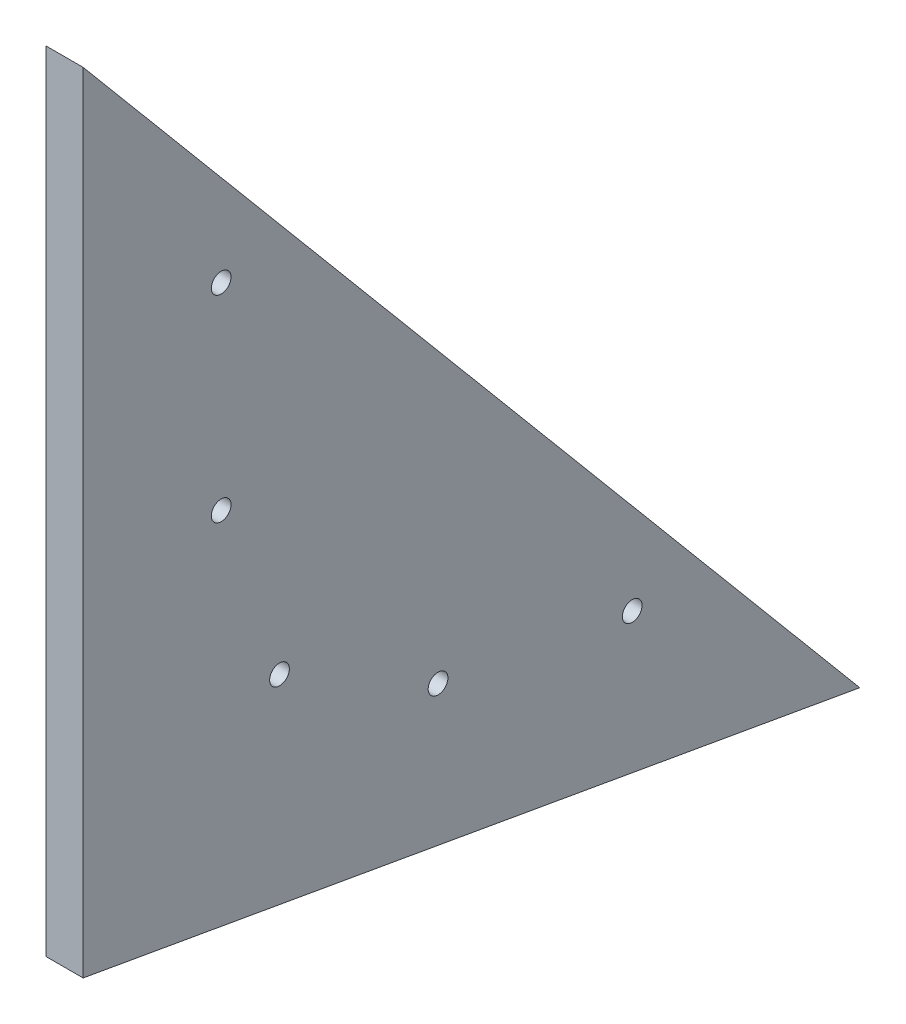
ISO-10303-21;
HEADER;
FILE_DESCRIPTION(('STEP AP214'),'2;1');
FILE_NAME('part.step','',(''),(''),'','','');
FILE_SCHEMA(('AUTOMOTIVE_DESIGN { 1 0 10303 214 1 1 1 1 }'));
ENDSEC;
DATA;
#1=APPLICATION_CONTEXT('core data for automotive mechanical design processes');
#2=APPLICATION_PROTOCOL_DEFINITION('international standard','automotive_design',2000,#1);
#3=PRODUCT_CONTEXT('',#1,'mechanical');
#4=PRODUCT('Part','Part','',(#3));
#5=PRODUCT_RELATED_PRODUCT_CATEGORY('part','',(#4));
#6=PRODUCT_DEFINITION_FORMATION('','',#4);
#7=PRODUCT_DEFINITION_CONTEXT('part definition',#1,'design');
#8=PRODUCT_DEFINITION('design','',#6,#7);
#9=PRODUCT_DEFINITION_SHAPE('','',#8);
#10=(LENGTH_UNIT() NAMED_UNIT(*) SI_UNIT(.MILLI.,.METRE.));
#11=(NAMED_UNIT(*) PLANE_ANGLE_UNIT() SI_UNIT($,.RADIAN.));
#12=(NAMED_UNIT(*) SI_UNIT($,.STERADIAN.) SOLID_ANGLE_UNIT());
#13=UNCERTAINTY_MEASURE_WITH_UNIT(LENGTH_MEASURE(1.E-05),#10,'distance_accuracy_value','');
#14=(GEOMETRIC_REPRESENTATION_CONTEXT(3) GLOBAL_UNCERTAINTY_ASSIGNED_CONTEXT((#13)) GLOBAL_UNIT_ASSIGNED_CONTEXT((#10,
#11,#12)) REPRESENTATION_CONTEXT('',''));
#15=CARTESIAN_POINT('',(0.,0.,0.));
#16=DIRECTION('',(0.,0.,1.));
#17=DIRECTION('',(1.,0.,0.));
#18=AXIS2_PLACEMENT_3D('',#15,#16,#17);
#19=CARTESIAN_POINT('',(11.90625,0.,0.));
#20=DIRECTION('',(0.,0.984807753012207,-0.173648177666934));
#21=DIRECTION('',(0.,0.173648177666934,0.984807753012208));
#22=AXIS2_PLACEMENT_3D('',#19,#20,#21);
#23=PLANE('',#22);
#24=DIRECTION('',(0.,-0.173648177666934,-0.984807753012207));
#25=VECTOR('',#24,1.);
#26=CARTESIAN_POINT('',(0.,0.,0.));
#27=LINE('',#26,#25);
#28=CARTESIAN_POINT('',(0.,0.,0.));
#29=VERTEX_POINT('',#28);
#30=CARTESIAN_POINT('',(0.,-44.1066371274012,-250.141169265101));
#31=VERTEX_POINT('',#30);
#32=EDGE_CURVE('E79',#29,#31,#27,.T.);
#33=ORIENTED_EDGE('',*,*,#32,.T.);
#34=DIRECTION('',(-1.,0.,0.));
#35=VECTOR('',#34,1.);
#36=CARTESIAN_POINT('',(11.90625,-44.1066371274012,-250.141169265101));
#37=LINE('',#36,#35);
#38=CARTESIAN_POINT('',(11.90625,-44.1066371274012,-250.141169265101));
#39=VERTEX_POINT('',#38);
#40=EDGE_CURVE('E11',#39,#31,#37,.T.);
#41=ORIENTED_EDGE('',*,*,#40,.F.);
#42=DIRECTION('',(0.,-0.173648177666934,-0.984807753012207));
#43=VECTOR('',#42,1.);
#44=CARTESIAN_POINT('',(11.90625,0.,0.));
#45=LINE('',#44,#43);
#46=CARTESIAN_POINT('',(11.90625,0.,0.));
#47=VERTEX_POINT('',#46);
#48=EDGE_CURVE('E72',#47,#39,#45,.T.);
#49=ORIENTED_EDGE('',*,*,#48,.F.);
#50=DIRECTION('',(-1.,0.,0.));
#51=VECTOR('',#50,1.);
#52=CARTESIAN_POINT('',(11.90625,0.,0.));
#53=LINE('',#52,#51);
#54=EDGE_CURVE('E80',#47,#29,#53,.T.);
#55=ORIENTED_EDGE('',*,*,#54,.T.);
#56=EDGE_LOOP('',(#33,#41,#49,#55));
#57=FACE_BOUND('',#56,.T.);
#58=ADVANCED_FACE('F32',(#57),#23,.F.);
#59=CARTESIAN_POINT('',(11.90625,254.,0.));
#60=DIRECTION('',(0.,-0.642787609686538,0.766044443118979));
#61=DIRECTION('',(0.,-0.766044443118979,-0.642787609686538));
#62=AXIS2_PLACEMENT_3D('',#59,#60,#61);
#63=PLANE('',#62);
#64=DIRECTION('',(0.,0.766044443118979,0.642787609686538));
#65=VECTOR('',#64,1.);
#66=CARTESIAN_POINT('',(0.,254.,0.));
#67=LINE('',#66,#65);
#68=CARTESIAN_POINT('',(0.,254.,0.));
#69=VERTEX_POINT('',#68);
#70=EDGE_CURVE('E60',#31,#69,#67,.T.);
#71=ORIENTED_EDGE('',*,*,#70,.T.);
#72=DIRECTION('',(-1.,0.,0.));
#73=VECTOR('',#72,1.);
#74=CARTESIAN_POINT('',(11.90625,254.,0.));
#75=LINE('',#74,#73);
#76=CARTESIAN_POINT('',(11.90625,254.,0.));
#77=VERTEX_POINT('',#76);
#78=EDGE_CURVE('E40',#77,#69,#75,.T.);
#79=ORIENTED_EDGE('',*,*,#78,.F.);
#80=DIRECTION('',(0.,0.766044443118979,0.642787609686538));
#81=VECTOR('',#80,1.);
#82=CARTESIAN_POINT('',(11.90625,254.,0.));
#83=LINE('',#82,#81);
#84=EDGE_CURVE('E68',#39,#77,#83,.T.);
#85=ORIENTED_EDGE('',*,*,#84,.F.);
#86=ORIENTED_EDGE('',*,*,#40,.T.);
#87=EDGE_LOOP('',(#71,#79,#85,#86));
#88=FACE_BOUND('',#87,.T.);
#89=ADVANCED_FACE('F69',(#88),#63,.F.);
#90=CARTESIAN_POINT('',(11.90625,0.,0.));
#91=DIRECTION('',(0.,0.,-1.));
#92=DIRECTION('',(-1.,0.,0.));
#93=AXIS2_PLACEMENT_3D('',#90,#91,#92);
#94=PLANE('',#93);
#95=DIRECTION('',(0.,-1.,0.));
#96=VECTOR('',#95,1.);
#97=CARTESIAN_POINT('',(0.,0.,0.));
#98=LINE('',#97,#96);
#99=EDGE_CURVE('E65',#69,#29,#98,.T.);
#100=ORIENTED_EDGE('',*,*,#99,.T.);
#101=ORIENTED_EDGE('',*,*,#54,.F.);
#102=DIRECTION('',(0.,-1.,0.));
#103=VECTOR('',#102,1.);
#104=CARTESIAN_POINT('',(11.90625,0.,0.));
#105=LINE('',#104,#103);
#106=EDGE_CURVE('E48',#77,#47,#105,.T.);
#107=ORIENTED_EDGE('',*,*,#106,.F.);
#108=ORIENTED_EDGE('',*,*,#78,.T.);
#109=EDGE_LOOP('',(#100,#101,#107,#108));
#110=FACE_BOUND('',#109,.T.);
#111=ADVANCED_FACE('F91',(#110),#94,.F.);
#112=CARTESIAN_POINT('',(11.90625,0.,0.));
#113=DIRECTION('',(1.,0.,0.));
#114=DIRECTION('',(0.,0.,-1.));
#115=AXIS2_PLACEMENT_3D('',#112,#113,#114);
#116=PLANE('',#115);
#117=CARTESIAN_POINT('',(11.90625,171.725527446049,-44.45));
#118=DIRECTION('',(-1.,0.,0.));
#119=DIRECTION('',(0.,0.,1.));
#120=AXIS2_PLACEMENT_3D('',#117,#118,#119);
#121=CIRCLE('',#120,3.17499999999998);
#122=CARTESIAN_POINT('',(11.90625,171.725527446049,-41.275));
#123=VERTEX_POINT('',#122);
#124=EDGE_CURVE('E178',#123,#123,#121,.T.);
#125=ORIENTED_EDGE('',*,*,#124,.T.);
#126=EDGE_LOOP('',(#125));
#127=FACE_BOUND('',#126,.T.);
#128=CARTESIAN_POINT('',(11.90625,108.225527446049,-44.45));
#129=DIRECTION('',(-1.,0.,0.));
#130=DIRECTION('',(0.,0.,1.));
#131=AXIS2_PLACEMENT_3D('',#128,#129,#130);
#132=CIRCLE('',#131,3.175);
#133=CARTESIAN_POINT('',(11.90625,108.225527446049,-41.275));
#134=VERTEX_POINT('',#133);
#135=EDGE_CURVE('E187',#134,#134,#132,.T.);
#136=ORIENTED_EDGE('',*,*,#135,.T.);
#137=EDGE_LOOP('',(#136));
#138=FACE_BOUND('',#137,.T.);
#139=CARTESIAN_POINT('',(11.90625,53.0621171796237,-63.2369687794717));
#140=DIRECTION('',(-1.,0.,0.));
#141=DIRECTION('',(0.,0.,1.));
#142=AXIS2_PLACEMENT_3D('',#139,#140,#141);
#143=CIRCLE('',#142,3.175);
#144=CARTESIAN_POINT('',(11.90625,53.0621171796237,-60.0619687794717));
#145=VERTEX_POINT('',#144);
#146=EDGE_CURVE('E193',#145,#145,#143,.T.);
#147=ORIENTED_EDGE('',*,*,#146,.T.);
#148=EDGE_LOOP('',(#147));
#149=FACE_BOUND('',#148,.T.);
#150=CARTESIAN_POINT('',(11.90625,24.9815390033435,-114.3));
#151=DIRECTION('',(-1.,0.,0.));
#152=DIRECTION('',(0.,0.,1.));
#153=AXIS2_PLACEMENT_3D('',#150,#151,#152);
#154=CIRCLE('',#153,3.17499999999999);
#155=CARTESIAN_POINT('',(11.90625,24.9815390033435,-111.125));
#156=VERTEX_POINT('',#155);
#157=EDGE_CURVE('E199',#156,#156,#154,.T.);
#158=ORIENTED_EDGE('',*,*,#157,.T.);
#159=EDGE_LOOP('',(#158));
#160=FACE_BOUND('',#159,.T.);
#161=CARTESIAN_POINT('',(11.90625,13.9548797214933,-176.835292316275));
#162=DIRECTION('',(-1.,0.,0.));
#163=DIRECTION('',(0.,0.,1.));
#164=AXIS2_PLACEMENT_3D('',#161,#162,#163);
#165=CIRCLE('',#164,3.17499999999999);
#166=CARTESIAN_POINT('',(11.90625,13.9548797214933,-173.660292316275));
#167=VERTEX_POINT('',#166);
#168=EDGE_CURVE('E82',#167,#167,#165,.T.);
#169=ORIENTED_EDGE('',*,*,#168,.T.);
#170=EDGE_LOOP('',(#169));
#171=FACE_BOUND('',#170,.T.);
#172=ORIENTED_EDGE('',*,*,#48,.T.);
#173=ORIENTED_EDGE('',*,*,#84,.T.);
#174=ORIENTED_EDGE('',*,*,#106,.T.);
#175=EDGE_LOOP('',(#172,#173,#174));
#176=FACE_BOUND('',#175,.T.);
#177=ADVANCED_FACE('F75',(#127,#138,#149,#160,#171,#176),#116,.T.);
#178=CARTESIAN_POINT('',(0.,0.,0.));
#179=DIRECTION('',(1.,0.,0.));
#180=DIRECTION('',(0.,0.,-1.));
#181=AXIS2_PLACEMENT_3D('',#178,#179,#180);
#182=PLANE('',#181);
#183=CARTESIAN_POINT('',(0.,171.725527446049,-44.45));
#184=DIRECTION('',(-1.,0.,0.));
#185=DIRECTION('',(0.,0.,1.));
#186=AXIS2_PLACEMENT_3D('',#183,#184,#185);
#187=CIRCLE('',#186,3.17499999999998);
#188=CARTESIAN_POINT('',(0.,171.725527446049,-41.275));
#189=VERTEX_POINT('',#188);
#190=EDGE_CURVE('E180',#189,#189,#187,.T.);
#191=ORIENTED_EDGE('',*,*,#190,.F.);
#192=EDGE_LOOP('',(#191));
#193=FACE_BOUND('',#192,.T.);
#194=CARTESIAN_POINT('',(0.,108.225527446049,-44.45));
#195=DIRECTION('',(-1.,0.,0.));
#196=DIRECTION('',(0.,0.,1.));
#197=AXIS2_PLACEMENT_3D('',#194,#195,#196);
#198=CIRCLE('',#197,3.17499999999998);
#199=CARTESIAN_POINT('',(0.,108.225527446049,-41.275));
#200=VERTEX_POINT('',#199);
#201=EDGE_CURVE('E182',#200,#200,#198,.T.);
#202=ORIENTED_EDGE('',*,*,#201,.F.);
#203=EDGE_LOOP('',(#202));
#204=FACE_BOUND('',#203,.T.);
#205=CARTESIAN_POINT('',(0.,53.0621171796237,-63.2369687794717));
#206=DIRECTION('',(-1.,0.,0.));
#207=DIRECTION('',(0.,0.,1.));
#208=AXIS2_PLACEMENT_3D('',#205,#206,#207);
#209=CIRCLE('',#208,3.17499999999998);
#210=CARTESIAN_POINT('',(0.,53.0621171796237,-60.0619687794717));
#211=VERTEX_POINT('',#210);
#212=EDGE_CURVE('E190',#211,#211,#209,.T.);
#213=ORIENTED_EDGE('',*,*,#212,.F.);
#214=EDGE_LOOP('',(#213));
#215=FACE_BOUND('',#214,.T.);
#216=CARTESIAN_POINT('',(0.,24.9815390033435,-114.3));
#217=DIRECTION('',(-1.,0.,0.));
#218=DIRECTION('',(0.,0.,1.));
#219=AXIS2_PLACEMENT_3D('',#216,#217,#218);
#220=CIRCLE('',#219,3.17499999999999);
#221=CARTESIAN_POINT('',(0.,24.9815390033435,-111.125));
#222=VERTEX_POINT('',#221);
#223=EDGE_CURVE('E196',#222,#222,#220,.T.);
#224=ORIENTED_EDGE('',*,*,#223,.F.);
#225=EDGE_LOOP('',(#224));
#226=FACE_BOUND('',#225,.T.);
#227=CARTESIAN_POINT('',(0.,13.9548797214933,-176.835292316275));
#228=DIRECTION('',(-1.,0.,0.));
#229=DIRECTION('',(0.,0.,1.));
#230=AXIS2_PLACEMENT_3D('',#227,#228,#229);
#231=CIRCLE('',#230,3.17499999999999);
#232=CARTESIAN_POINT('',(0.,13.9548797214933,-173.660292316275));
#233=VERTEX_POINT('',#232);
#234=EDGE_CURVE('E86',#233,#233,#231,.T.);
#235=ORIENTED_EDGE('',*,*,#234,.F.);
#236=EDGE_LOOP('',(#235));
#237=FACE_BOUND('',#236,.T.);
#238=ORIENTED_EDGE('',*,*,#32,.F.);
#239=ORIENTED_EDGE('',*,*,#99,.F.);
#240=ORIENTED_EDGE('',*,*,#70,.F.);
#241=EDGE_LOOP('',(#238,#239,#240));
#242=FACE_BOUND('',#241,.T.);
#243=ADVANCED_FACE('F92',(#193,#204,#215,#226,#237,#242),#182,.F.);
#244=CARTESIAN_POINT('',(0.,13.9548797214933,-176.835292316275));
#245=DIRECTION('',(-1.,0.,0.));
#246=DIRECTION('',(0.,0.,1.));
#247=AXIS2_PLACEMENT_3D('',#244,#245,#246);
#248=CYLINDRICAL_SURFACE('',#247,3.17499999999999);
#249=ORIENTED_EDGE('',*,*,#168,.F.);
#250=EDGE_LOOP('',(#249));
#251=FACE_BOUND('',#250,.T.);
#252=ORIENTED_EDGE('',*,*,#234,.T.);
#253=EDGE_LOOP('',(#252));
#254=FACE_BOUND('',#253,.T.);
#255=ADVANCED_FACE('F94',(#251,#254),#248,.F.);
#256=CARTESIAN_POINT('',(0.,24.9815390033435,-114.3));
#257=DIRECTION('',(-1.,0.,0.));
#258=DIRECTION('',(0.,0.,1.));
#259=AXIS2_PLACEMENT_3D('',#256,#257,#258);
#260=CYLINDRICAL_SURFACE('',#259,3.17499999999999);
#261=ORIENTED_EDGE('',*,*,#157,.F.);
#262=EDGE_LOOP('',(#261));
#263=FACE_BOUND('',#262,.T.);
#264=ORIENTED_EDGE('',*,*,#223,.T.);
#265=EDGE_LOOP('',(#264));
#266=FACE_BOUND('',#265,.T.);
#267=ADVANCED_FACE('F101',(#263,#266),#260,.F.);
#268=CARTESIAN_POINT('',(0.,53.0621171796237,-63.2369687794717));
#269=DIRECTION('',(-1.,0.,0.));
#270=DIRECTION('',(0.,0.,1.));
#271=AXIS2_PLACEMENT_3D('',#268,#269,#270);
#272=CYLINDRICAL_SURFACE('',#271,3.17499999999999);
#273=ORIENTED_EDGE('',*,*,#146,.F.);
#274=EDGE_LOOP('',(#273));
#275=FACE_BOUND('',#274,.T.);
#276=ORIENTED_EDGE('',*,*,#212,.T.);
#277=EDGE_LOOP('',(#276));
#278=FACE_BOUND('',#277,.T.);
#279=ADVANCED_FACE('F141',(#275,#278),#272,.F.);
#280=CARTESIAN_POINT('',(0.,108.225527446049,-44.45));
#281=DIRECTION('',(-1.,0.,0.));
#282=DIRECTION('',(0.,0.,1.));
#283=AXIS2_PLACEMENT_3D('',#280,#281,#282);
#284=CYLINDRICAL_SURFACE('',#283,3.17499999999999);
#285=ORIENTED_EDGE('',*,*,#135,.F.);
#286=EDGE_LOOP('',(#285));
#287=FACE_BOUND('',#286,.T.);
#288=ORIENTED_EDGE('',*,*,#201,.T.);
#289=EDGE_LOOP('',(#288));
#290=FACE_BOUND('',#289,.T.);
#291=ADVANCED_FACE('F151',(#287,#290),#284,.F.);
#292=CARTESIAN_POINT('',(0.,171.725527446049,-44.45));
#293=DIRECTION('',(-1.,0.,0.));
#294=DIRECTION('',(0.,0.,1.));
#295=AXIS2_PLACEMENT_3D('',#292,#293,#294);
#296=CYLINDRICAL_SURFACE('',#295,3.17499999999998);
#297=ORIENTED_EDGE('',*,*,#124,.F.);
#298=EDGE_LOOP('',(#297));
#299=FACE_BOUND('',#298,.T.);
#300=ORIENTED_EDGE('',*,*,#190,.T.);
#301=EDGE_LOOP('',(#300));
#302=FACE_BOUND('',#301,.T.);
#303=ADVANCED_FACE('F161',(#299,#302),#296,.F.);
#304=CLOSED_SHELL('',(#58,#89,#111,#177,#243,#255,#267,#279,#291,#303));
#305=MANIFOLD_SOLID_BREP('B2',#304);
#306=ADVANCED_BREP_SHAPE_REPRESENTATION('',(#18,#305),#14);
#307=SHAPE_DEFINITION_REPRESENTATION(#9,#306);
ENDSEC;
END-ISO-10303-21;
